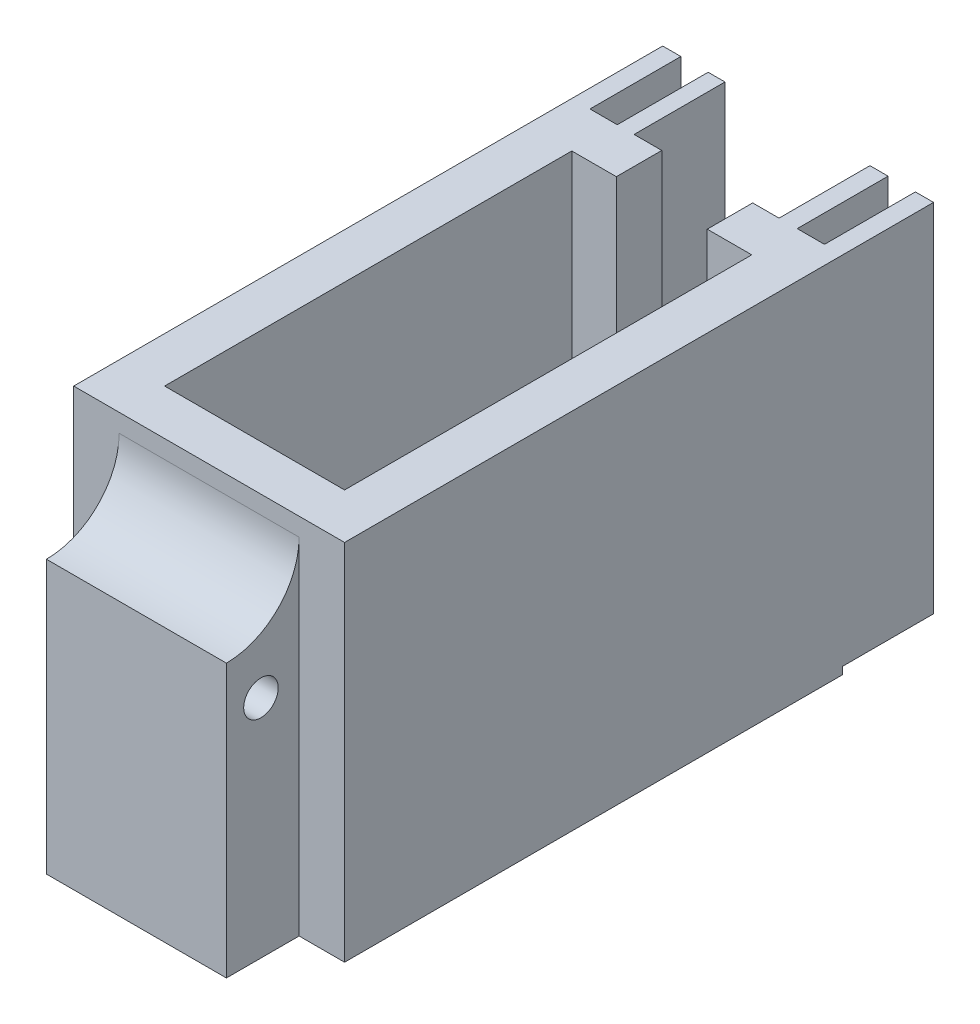
ISO-10303-21;
HEADER;
FILE_DESCRIPTION(('STEP AP214'),'2;1');
FILE_NAME('part.step','',(''),(''),'','','');
FILE_SCHEMA(('AUTOMOTIVE_DESIGN { 1 0 10303 214 1 1 1 1 }'));
ENDSEC;
DATA;
#1=APPLICATION_CONTEXT('core data for automotive mechanical design processes');
#2=APPLICATION_PROTOCOL_DEFINITION('international standard','automotive_design',2000,#1);
#3=PRODUCT_CONTEXT('',#1,'mechanical');
#4=PRODUCT('Part','Part','',(#3));
#5=PRODUCT_RELATED_PRODUCT_CATEGORY('part','',(#4));
#6=PRODUCT_DEFINITION_FORMATION('','',#4);
#7=PRODUCT_DEFINITION_CONTEXT('part definition',#1,'design');
#8=PRODUCT_DEFINITION('design','',#6,#7);
#9=PRODUCT_DEFINITION_SHAPE('','',#8);
#10=(LENGTH_UNIT() NAMED_UNIT(*) SI_UNIT(.MILLI.,.METRE.));
#11=(NAMED_UNIT(*) PLANE_ANGLE_UNIT() SI_UNIT($,.RADIAN.));
#12=(NAMED_UNIT(*) SI_UNIT($,.STERADIAN.) SOLID_ANGLE_UNIT());
#13=UNCERTAINTY_MEASURE_WITH_UNIT(LENGTH_MEASURE(1.E-05),#10,'distance_accuracy_value','');
#14=(GEOMETRIC_REPRESENTATION_CONTEXT(3) GLOBAL_UNCERTAINTY_ASSIGNED_CONTEXT((#13)) GLOBAL_UNIT_ASSIGNED_CONTEXT((#10,
#11,#12)) REPRESENTATION_CONTEXT('',''));
#15=CARTESIAN_POINT('',(0.,0.,0.));
#16=DIRECTION('',(0.,0.,1.));
#17=DIRECTION('',(1.,0.,0.));
#18=AXIS2_PLACEMENT_3D('',#15,#16,#17);
#19=CARTESIAN_POINT('',(0.,50.8,-7.19349999999999));
#20=DIRECTION('',(0.,0.,-1.));
#21=DIRECTION('',(-1.,0.,0.));
#22=AXIS2_PLACEMENT_3D('',#19,#20,#21);
#23=PLANE('',#22);
#24=DIRECTION('',(1.,0.,0.));
#25=VECTOR('',#24,1.);
#26=CARTESIAN_POINT('',(0.,50.8,-7.19349999999999));
#27=LINE('',#26,#25);
#28=CARTESIAN_POINT('',(0.839999999999997,50.8,-7.19349999999999));
#29=VERTEX_POINT('',#28);
#30=CARTESIAN_POINT('',(4.65,50.8,-7.19349999999999));
#31=VERTEX_POINT('',#30);
#32=EDGE_CURVE('E473',#29,#31,#27,.T.);
#33=ORIENTED_EDGE('',*,*,#32,.T.);
#34=DIRECTION('',(0.,-1.,0.));
#35=VECTOR('',#34,1.);
#36=CARTESIAN_POINT('',(4.65,63.7515095645257,-7.19349999999999));
#37=LINE('',#36,#35);
#38=CARTESIAN_POINT('',(4.65,5.588,-7.19349999999999));
#39=VERTEX_POINT('',#38);
#40=EDGE_CURVE('E304',#31,#39,#37,.T.);
#41=ORIENTED_EDGE('',*,*,#40,.T.);
#42=DIRECTION('',(1.,0.,0.));
#43=VECTOR('',#42,1.);
#44=CARTESIAN_POINT('',(0.,5.588,-7.19349999999999));
#45=LINE('',#44,#43);
#46=CARTESIAN_POINT('',(0.839999999999997,5.588,-7.19349999999999));
#47=VERTEX_POINT('',#46);
#48=EDGE_CURVE('E409',#47,#39,#45,.T.);
#49=ORIENTED_EDGE('',*,*,#48,.F.);
#50=DIRECTION('',(0.,-1.,0.));
#51=VECTOR('',#50,1.);
#52=CARTESIAN_POINT('',(0.839999999999997,63.7515095645257,-7.19349999999999));
#53=LINE('',#52,#51);
#54=EDGE_CURVE('E326',#29,#47,#53,.T.);
#55=ORIENTED_EDGE('',*,*,#54,.F.);
#56=EDGE_LOOP('',(#33,#41,#49,#55));
#57=FACE_BOUND('',#56,.T.);
#58=ADVANCED_FACE('F45',(#57),#23,.T.);
#59=CARTESIAN_POINT('',(-5.383,50.8,-7.19349999999999));
#60=VERTEX_POINT('',#59);
#61=CARTESIAN_POINT('',(-1.7,50.8,-7.19349999999999));
#62=VERTEX_POINT('',#61);
#63=EDGE_CURVE('E477',#60,#62,#27,.T.);
#64=ORIENTED_EDGE('',*,*,#63,.T.);
#65=DIRECTION('',(0.,-1.,0.));
#66=VECTOR('',#65,1.);
#67=CARTESIAN_POINT('',(-1.7,63.7515095645257,-7.19349999999999));
#68=LINE('',#67,#66);
#69=CARTESIAN_POINT('',(-1.7,5.588,-7.19349999999999));
#70=VERTEX_POINT('',#69);
#71=EDGE_CURVE('E330',#62,#70,#68,.T.);
#72=ORIENTED_EDGE('',*,*,#71,.T.);
#73=CARTESIAN_POINT('',(-21.9525084883911,5.588,-7.19349999999999));
#74=VERTEX_POINT('',#73);
#75=EDGE_CURVE('E413',#74,#70,#45,.T.);
#76=ORIENTED_EDGE('',*,*,#75,.F.);
#77=DIRECTION('',(0.,-1.,0.));
#78=VECTOR('',#77,1.);
#79=CARTESIAN_POINT('',(-21.9525084883911,63.7515095645257,-7.19349999999999));
#80=LINE('',#79,#78);
#81=CARTESIAN_POINT('',(-21.9525084883911,50.8,-7.19349999999999));
#82=VERTEX_POINT('',#81);
#83=EDGE_CURVE('E68',#82,#74,#80,.T.);
#84=ORIENTED_EDGE('',*,*,#83,.F.);
#85=CARTESIAN_POINT('',(-18.083,50.8,-7.19349999999999));
#86=VERTEX_POINT('',#85);
#87=EDGE_CURVE('E479',#82,#86,#27,.T.);
#88=ORIENTED_EDGE('',*,*,#87,.T.);
#89=DIRECTION('',(0.,1.,0.));
#90=VECTOR('',#89,1.);
#91=CARTESIAN_POINT('',(-18.083,50.8,-7.19349999999999));
#92=LINE('',#91,#90);
#93=CARTESIAN_POINT('',(-18.083,29.21,-7.19349999999999));
#94=VERTEX_POINT('',#93);
#95=EDGE_CURVE('E462',#94,#86,#92,.T.);
#96=ORIENTED_EDGE('',*,*,#95,.F.);
#97=DIRECTION('',(-1.,0.,0.));
#98=VECTOR('',#97,1.);
#99=CARTESIAN_POINT('',(0.,29.21,-7.19349999999999));
#100=LINE('',#99,#98);
#101=CARTESIAN_POINT('',(-5.383,29.21,-7.19349999999999));
#102=VERTEX_POINT('',#101);
#103=EDGE_CURVE('E563',#102,#94,#100,.T.);
#104=ORIENTED_EDGE('',*,*,#103,.F.);
#105=DIRECTION('',(0.,-1.,0.));
#106=VECTOR('',#105,1.);
#107=CARTESIAN_POINT('',(-5.383,50.8,-7.19349999999999));
#108=LINE('',#107,#106);
#109=EDGE_CURVE('E456',#60,#102,#108,.T.);
#110=ORIENTED_EDGE('',*,*,#109,.F.);
#111=EDGE_LOOP('',(#64,#72,#76,#84,#88,#96,#104,#110));
#112=FACE_BOUND('',#111,.T.);
#113=ADVANCED_FACE('F624',(#112),#23,.T.);
#114=DIRECTION('',(0.,-1.,0.));
#115=VECTOR('',#114,1.);
#116=CARTESIAN_POINT('',(-24.306,63.7515095645257,-7.19349999999999));
#117=LINE('',#116,#115);
#118=CARTESIAN_POINT('',(-24.306,50.8,-7.19349999999999));
#119=VERTEX_POINT('',#118);
#120=CARTESIAN_POINT('',(-24.306,5.588,-7.19349999999999));
#121=VERTEX_POINT('',#120);
#122=EDGE_CURVE('E359',#119,#121,#117,.T.);
#123=ORIENTED_EDGE('',*,*,#122,.T.);
#124=CARTESIAN_POINT('',(-28.116,5.588,-7.19349999999999));
#125=VERTEX_POINT('',#124);
#126=EDGE_CURVE('E414',#125,#121,#45,.T.);
#127=ORIENTED_EDGE('',*,*,#126,.F.);
#128=DIRECTION('',(0.,-1.,0.));
#129=VECTOR('',#128,1.);
#130=CARTESIAN_POINT('',(-28.116,63.7515095645257,-7.19349999999999));
#131=LINE('',#130,#129);
#132=CARTESIAN_POINT('',(-28.116,50.8,-7.19349999999999));
#133=VERTEX_POINT('',#132);
#134=EDGE_CURVE('E298',#133,#125,#131,.T.);
#135=ORIENTED_EDGE('',*,*,#134,.F.);
#136=EDGE_CURVE('E485',#133,#119,#27,.T.);
#137=ORIENTED_EDGE('',*,*,#136,.T.);
#138=EDGE_LOOP('',(#123,#127,#135,#137));
#139=FACE_BOUND('',#138,.T.);
#140=ADVANCED_FACE('F634',(#139),#23,.T.);
#141=CARTESIAN_POINT('',(0.,5.588,0.));
#142=DIRECTION('',(0.,1.,0.));
#143=DIRECTION('',(0.,0.,1.));
#144=AXIS2_PLACEMENT_3D('',#141,#142,#143);
#145=PLANE('',#144);
#146=ORIENTED_EDGE('',*,*,#48,.T.);
#147=DIRECTION('',(0.,0.,1.));
#148=VECTOR('',#147,1.);
#149=CARTESIAN_POINT('',(4.65,5.588,0.));
#150=LINE('',#149,#148);
#151=CARTESIAN_POINT('',(4.64999999999999,5.588,-19.8935));
#152=VERTEX_POINT('',#151);
#153=EDGE_CURVE('E301',#152,#39,#150,.T.);
#154=ORIENTED_EDGE('',*,*,#153,.F.);
#155=DIRECTION('',(1.,0.,0.));
#156=VECTOR('',#155,1.);
#157=CARTESIAN_POINT('',(0.,5.588,-19.8935));
#158=LINE('',#157,#156);
#159=CARTESIAN_POINT('',(0.839999999999997,5.588,-19.8935));
#160=VERTEX_POINT('',#159);
#161=EDGE_CURVE('E415',#160,#152,#158,.T.);
#162=ORIENTED_EDGE('',*,*,#161,.F.);
#163=DIRECTION('',(0.,0.,-1.));
#164=VECTOR('',#163,1.);
#165=CARTESIAN_POINT('',(0.839999999999996,5.588,0.));
#166=LINE('',#165,#164);
#167=EDGE_CURVE('E321',#47,#160,#166,.T.);
#168=ORIENTED_EDGE('',*,*,#167,.F.);
#169=EDGE_LOOP('',(#146,#154,#162,#168));
#170=FACE_BOUND('',#169,.T.);
#171=ADVANCED_FACE('F614',(#170),#145,.T.);
#172=CARTESIAN_POINT('',(-5.383,5.588,-13.7975));
#173=DIRECTION('',(0.,1.,0.));
#174=DIRECTION('',(0.,0.,1.));
#175=AXIS2_PLACEMENT_3D('',#172,#173,#174);
#176=CIRCLE('',#175,2.032);
#177=CARTESIAN_POINT('',(-5.383,5.588,-11.7655));
#178=VERTEX_POINT('',#177);
#179=EDGE_CURVE('E400',#178,#178,#176,.T.);
#180=ORIENTED_EDGE('',*,*,#179,.F.);
#181=EDGE_LOOP('',(#180));
#182=FACE_BOUND('',#181,.T.);
#183=CARTESIAN_POINT('',(-18.083,5.588,-13.7975));
#184=DIRECTION('',(0.,1.,0.));
#185=DIRECTION('',(0.,0.,1.));
#186=AXIS2_PLACEMENT_3D('',#183,#184,#185);
#187=CIRCLE('',#186,2.032);
#188=CARTESIAN_POINT('',(-18.083,5.588,-11.7655));
#189=VERTEX_POINT('',#188);
#190=EDGE_CURVE('E404',#189,#189,#187,.T.);
#191=ORIENTED_EDGE('',*,*,#190,.F.);
#192=EDGE_LOOP('',(#191));
#193=FACE_BOUND('',#192,.T.);
#194=ORIENTED_EDGE('',*,*,#75,.T.);
#195=DIRECTION('',(0.,0.,1.));
#196=VECTOR('',#195,1.);
#197=CARTESIAN_POINT('',(-1.7,5.588,0.));
#198=LINE('',#197,#196);
#199=CARTESIAN_POINT('',(-1.70000000000001,5.588,-19.8935));
#200=VERTEX_POINT('',#199);
#201=EDGE_CURVE('E327',#200,#70,#198,.T.);
#202=ORIENTED_EDGE('',*,*,#201,.F.);
#203=CARTESIAN_POINT('',(-21.9525084883911,5.588,-19.8935));
#204=VERTEX_POINT('',#203);
#205=EDGE_CURVE('E419',#204,#200,#158,.T.);
#206=ORIENTED_EDGE('',*,*,#205,.F.);
#207=DIRECTION('',(0.,0.,1.));
#208=VECTOR('',#207,1.);
#209=CARTESIAN_POINT('',(-21.9525084883911,5.588,0.));
#210=LINE('',#209,#208);
#211=EDGE_CURVE('E356',#204,#74,#210,.T.);
#212=ORIENTED_EDGE('',*,*,#211,.T.);
#213=EDGE_LOOP('',(#194,#202,#206,#212));
#214=FACE_BOUND('',#213,.T.);
#215=ADVANCED_FACE('F648',(#182,#193,#214),#145,.T.);
#216=DIRECTION('',(0.,0.,-1.));
#217=VECTOR('',#216,1.);
#218=CARTESIAN_POINT('',(-24.306,5.588,0.));
#219=LINE('',#218,#217);
#220=CARTESIAN_POINT('',(-24.306,5.588,-19.8935));
#221=VERTEX_POINT('',#220);
#222=EDGE_CURVE('E353',#121,#221,#219,.T.);
#223=ORIENTED_EDGE('',*,*,#222,.T.);
#224=CARTESIAN_POINT('',(-28.116,5.588,-19.8935));
#225=VERTEX_POINT('',#224);
#226=EDGE_CURVE('E420',#225,#221,#158,.T.);
#227=ORIENTED_EDGE('',*,*,#226,.F.);
#228=DIRECTION('',(0.,0.,-1.));
#229=VECTOR('',#228,1.);
#230=CARTESIAN_POINT('',(-28.116,5.588,0.));
#231=LINE('',#230,#229);
#232=EDGE_CURVE('E384',#125,#225,#231,.T.);
#233=ORIENTED_EDGE('',*,*,#232,.F.);
#234=ORIENTED_EDGE('',*,*,#126,.T.);
#235=EDGE_LOOP('',(#223,#227,#233,#234));
#236=FACE_BOUND('',#235,.T.);
#237=ADVANCED_FACE('F654',(#236),#145,.T.);
#238=DIRECTION('',(0.,-1.,0.));
#239=VECTOR('',#238,1.);
#240=CARTESIAN_POINT('',(-30.656,50.8,-7.19349999999999));
#241=LINE('',#240,#239);
#242=CARTESIAN_POINT('',(-30.656,1.016,-7.19349999999999));
#243=VERTEX_POINT('',#242);
#244=CARTESIAN_POINT('',(-30.656,0.,-7.19349999999999));
#245=VERTEX_POINT('',#244);
#246=EDGE_CURVE('E539',#243,#245,#241,.T.);
#247=ORIENTED_EDGE('',*,*,#246,.F.);
#248=DIRECTION('',(1.,0.,0.));
#249=VECTOR('',#248,1.);
#250=CARTESIAN_POINT('',(0.,1.016,-7.19349999999999));
#251=LINE('',#250,#249);
#252=CARTESIAN_POINT('',(7.19,1.016,-7.19349999999999));
#253=VERTEX_POINT('',#252);
#254=EDGE_CURVE('E432',#243,#253,#251,.T.);
#255=ORIENTED_EDGE('',*,*,#254,.T.);
#256=DIRECTION('',(0.,-1.,0.));
#257=VECTOR('',#256,1.);
#258=CARTESIAN_POINT('',(7.19,50.8,-7.19349999999999));
#259=LINE('',#258,#257);
#260=CARTESIAN_POINT('',(7.19,0.,-7.19349999999999));
#261=VERTEX_POINT('',#260);
#262=EDGE_CURVE('E509',#253,#261,#259,.T.);
#263=ORIENTED_EDGE('',*,*,#262,.T.);
#264=DIRECTION('',(1.,0.,0.));
#265=VECTOR('',#264,1.);
#266=CARTESIAN_POINT('',(0.,0.,-7.19349999999999));
#267=LINE('',#266,#265);
#268=EDGE_CURVE('E472',#245,#261,#267,.T.);
#269=ORIENTED_EDGE('',*,*,#268,.F.);
#270=EDGE_LOOP('',(#247,#255,#263,#269));
#271=FACE_BOUND('',#270,.T.);
#272=ADVANCED_FACE('F594',(#271),#23,.T.);
#273=CARTESIAN_POINT('',(-24.306,50.8,0.));
#274=DIRECTION('',(1.,0.,0.));
#275=DIRECTION('',(0.,0.,-1.));
#276=AXIS2_PLACEMENT_3D('',#273,#274,#275);
#277=PLANE('',#276);
#278=DIRECTION('',(0.,0.,1.));
#279=VECTOR('',#278,1.);
#280=CARTESIAN_POINT('',(-24.306,0.,0.));
#281=LINE('',#280,#279);
#282=CARTESIAN_POINT('',(-24.306,0.,-0.843499999999997));
#283=VERTEX_POINT('',#282);
#284=CARTESIAN_POINT('',(-24.306,0.,56.0525));
#285=VERTEX_POINT('',#284);
#286=EDGE_CURVE('E520',#283,#285,#281,.T.);
#287=ORIENTED_EDGE('',*,*,#286,.F.);
#288=DIRECTION('',(0.,-1.,0.));
#289=VECTOR('',#288,1.);
#290=CARTESIAN_POINT('',(-24.306,50.8,-0.843499999999997));
#291=LINE('',#290,#289);
#292=CARTESIAN_POINT('',(-24.306,50.8,-0.843499999999997));
#293=VERTEX_POINT('',#292);
#294=EDGE_CURVE('E545',#293,#283,#291,.T.);
#295=ORIENTED_EDGE('',*,*,#294,.F.);
#296=DIRECTION('',(0.,0.,1.));
#297=VECTOR('',#296,1.);
#298=CARTESIAN_POINT('',(-24.306,50.8,0.));
#299=LINE('',#298,#297);
#300=CARTESIAN_POINT('',(-24.306,50.8,56.0525));
#301=VERTEX_POINT('',#300);
#302=EDGE_CURVE('E492',#293,#301,#299,.T.);
#303=ORIENTED_EDGE('',*,*,#302,.T.);
#304=DIRECTION('',(0.,-1.,0.));
#305=VECTOR('',#304,1.);
#306=CARTESIAN_POINT('',(-24.306,50.8,56.0525));
#307=LINE('',#306,#305);
#308=EDGE_CURVE('E535',#301,#285,#307,.T.);
#309=ORIENTED_EDGE('',*,*,#308,.T.);
#310=EDGE_LOOP('',(#287,#295,#303,#309));
#311=FACE_BOUND('',#310,.T.);
#312=ADVANCED_FACE('F677',(#311),#277,.T.);
#313=CARTESIAN_POINT('',(0.,50.8,-0.8435));
#314=DIRECTION('',(0.,0.,1.));
#315=DIRECTION('',(1.,0.,0.));
#316=AXIS2_PLACEMENT_3D('',#313,#314,#315);
#317=PLANE('',#316);
#318=DIRECTION('',(0.,-1.,0.));
#319=VECTOR('',#318,1.);
#320=CARTESIAN_POINT('',(-18.083,50.8,-0.843499999999998));
#321=LINE('',#320,#319);
#322=CARTESIAN_POINT('',(-18.083,50.8,-0.8435));
#323=VERTEX_POINT('',#322);
#324=CARTESIAN_POINT('',(-18.083,29.21,-0.8435));
#325=VERTEX_POINT('',#324);
#326=EDGE_CURVE('E466',#323,#325,#321,.T.);
#327=ORIENTED_EDGE('',*,*,#326,.F.);
#328=DIRECTION('',(-1.,0.,0.));
#329=VECTOR('',#328,1.);
#330=CARTESIAN_POINT('',(0.,50.8,-0.8435));
#331=LINE('',#330,#329);
#332=EDGE_CURVE('E496',#323,#293,#331,.T.);
#333=ORIENTED_EDGE('',*,*,#332,.T.);
#334=ORIENTED_EDGE('',*,*,#294,.T.);
#335=DIRECTION('',(-1.,0.,0.));
#336=VECTOR('',#335,1.);
#337=CARTESIAN_POINT('',(0.,0.,-0.8435));
#338=LINE('',#337,#336);
#339=CARTESIAN_POINT('',(0.84,0.,-0.8435));
#340=VERTEX_POINT('',#339);
#341=EDGE_CURVE('E524',#340,#283,#338,.T.);
#342=ORIENTED_EDGE('',*,*,#341,.F.);
#343=DIRECTION('',(0.,-1.,0.));
#344=VECTOR('',#343,1.);
#345=CARTESIAN_POINT('',(0.84,50.8,-0.8435));
#346=LINE('',#345,#344);
#347=CARTESIAN_POINT('',(0.84,50.8,-0.8435));
#348=VERTEX_POINT('',#347);
#349=EDGE_CURVE('E542',#348,#340,#346,.T.);
#350=ORIENTED_EDGE('',*,*,#349,.F.);
#351=CARTESIAN_POINT('',(-5.383,50.8,-0.843499999999999));
#352=VERTEX_POINT('',#351);
#353=EDGE_CURVE('E497',#348,#352,#331,.T.);
#354=ORIENTED_EDGE('',*,*,#353,.T.);
#355=DIRECTION('',(0.,1.,0.));
#356=VECTOR('',#355,1.);
#357=CARTESIAN_POINT('',(-5.383,50.8,-0.843499999999999));
#358=LINE('',#357,#356);
#359=CARTESIAN_POINT('',(-5.383,29.21,-0.843500000000001));
#360=VERTEX_POINT('',#359);
#361=EDGE_CURVE('E459',#360,#352,#358,.T.);
#362=ORIENTED_EDGE('',*,*,#361,.F.);
#363=DIRECTION('',(1.,0.,0.));
#364=VECTOR('',#363,1.);
#365=CARTESIAN_POINT('',(0.,29.21,-0.8435));
#366=LINE('',#365,#364);
#367=EDGE_CURVE('E469',#325,#360,#366,.T.);
#368=ORIENTED_EDGE('',*,*,#367,.F.);
#369=EDGE_LOOP('',(#327,#333,#334,#342,#350,#354,#362,#368));
#370=FACE_BOUND('',#369,.T.);
#371=ADVANCED_FACE('F683',(#370),#317,.T.);
#372=CARTESIAN_POINT('',(0.84,50.8,0.));
#373=DIRECTION('',(-1.,0.,0.));
#374=DIRECTION('',(0.,0.,1.));
#375=AXIS2_PLACEMENT_3D('',#372,#373,#374);
#376=PLANE('',#375);
#377=DIRECTION('',(0.,0.,-1.));
#378=VECTOR('',#377,1.);
#379=CARTESIAN_POINT('',(0.84,0.,0.));
#380=LINE('',#379,#378);
#381=CARTESIAN_POINT('',(0.84,0.,56.0525));
#382=VERTEX_POINT('',#381);
#383=EDGE_CURVE('E528',#382,#340,#380,.T.);
#384=ORIENTED_EDGE('',*,*,#383,.F.);
#385=DIRECTION('',(0.,-1.,0.));
#386=VECTOR('',#385,1.);
#387=CARTESIAN_POINT('',(0.84,50.8,56.0525));
#388=LINE('',#387,#386);
#389=CARTESIAN_POINT('',(0.84,50.8,56.0525));
#390=VERTEX_POINT('',#389);
#391=EDGE_CURVE('E538',#390,#382,#388,.T.);
#392=ORIENTED_EDGE('',*,*,#391,.F.);
#393=DIRECTION('',(0.,0.,-1.));
#394=VECTOR('',#393,1.);
#395=CARTESIAN_POINT('',(0.84,50.8,0.));
#396=LINE('',#395,#394);
#397=EDGE_CURVE('E501',#390,#348,#396,.T.);
#398=ORIENTED_EDGE('',*,*,#397,.T.);
#399=ORIENTED_EDGE('',*,*,#349,.T.);
#400=EDGE_LOOP('',(#384,#392,#398,#399));
#401=FACE_BOUND('',#400,.T.);
#402=ADVANCED_FACE('F723',(#401),#376,.T.);
#403=CARTESIAN_POINT('',(-30.656,50.8,0.));
#404=DIRECTION('',(1.,0.,0.));
#405=DIRECTION('',(0.,0.,-1.));
#406=AXIS2_PLACEMENT_3D('',#403,#404,#405);
#407=PLANE('',#406);
#408=DIRECTION('',(0.,0.,1.));
#409=VECTOR('',#408,1.);
#410=CARTESIAN_POINT('',(-30.656,0.,0.));
#411=LINE('',#410,#409);
#412=CARTESIAN_POINT('',(-30.656,0.,62.4025));
#413=VERTEX_POINT('',#412);
#414=EDGE_CURVE('E513',#245,#413,#411,.T.);
#415=ORIENTED_EDGE('',*,*,#414,.T.);
#416=DIRECTION('',(0.,-1.,0.));
#417=VECTOR('',#416,1.);
#418=CARTESIAN_POINT('',(-30.656,50.8,62.4025));
#419=LINE('',#418,#417);
#420=CARTESIAN_POINT('',(-30.656,50.8,62.4025));
#421=VERTEX_POINT('',#420);
#422=EDGE_CURVE('E257',#421,#413,#419,.T.);
#423=ORIENTED_EDGE('',*,*,#422,.F.);
#424=DIRECTION('',(0.,0.,1.));
#425=VECTOR('',#424,1.);
#426=CARTESIAN_POINT('',(-30.656,50.8,0.));
#427=LINE('',#426,#425);
#428=CARTESIAN_POINT('',(-30.656,50.8,-19.8935));
#429=VERTEX_POINT('',#428);
#430=EDGE_CURVE('E480',#429,#421,#427,.T.);
#431=ORIENTED_EDGE('',*,*,#430,.F.);
#432=DIRECTION('',(0.,-1.,0.));
#433=VECTOR('',#432,1.);
#434=CARTESIAN_POINT('',(-30.656,5.588,-19.8935));
#435=LINE('',#434,#433);
#436=CARTESIAN_POINT('',(-30.656,1.016,-19.8935));
#437=VERTEX_POINT('',#436);
#438=EDGE_CURVE('E442',#429,#437,#435,.T.);
#439=ORIENTED_EDGE('',*,*,#438,.T.);
#440=DIRECTION('',(0.,0.,-1.));
#441=VECTOR('',#440,1.);
#442=CARTESIAN_POINT('',(-30.656,1.016,0.));
#443=LINE('',#442,#441);
#444=EDGE_CURVE('E428',#243,#437,#443,.T.);
#445=ORIENTED_EDGE('',*,*,#444,.F.);
#446=ORIENTED_EDGE('',*,*,#246,.T.);
#447=EDGE_LOOP('',(#415,#423,#431,#439,#445,#446));
#448=FACE_BOUND('',#447,.T.);
#449=ADVANCED_FACE('F591',(#448),#407,.F.);
#450=CARTESIAN_POINT('',(0.,50.8,62.4025));
#451=DIRECTION('',(0.,0.,1.));
#452=DIRECTION('',(1.,0.,0.));
#453=AXIS2_PLACEMENT_3D('',#450,#451,#452);
#454=PLANE('',#453);
#455=DIRECTION('',(-1.,0.,0.));
#456=VECTOR('',#455,1.);
#457=CARTESIAN_POINT('',(0.,50.8,62.4025));
#458=LINE('',#457,#456);
#459=CARTESIAN_POINT('',(7.19000000000001,50.8,62.4025));
#460=VERTEX_POINT('',#459);
#461=EDGE_CURVE('E484',#460,#421,#458,.T.);
#462=ORIENTED_EDGE('',*,*,#461,.T.);
#463=ORIENTED_EDGE('',*,*,#422,.T.);
#464=DIRECTION('',(-1.,0.,0.));
#465=VECTOR('',#464,1.);
#466=CARTESIAN_POINT('',(-30.656,0.,62.4025));
#467=LINE('',#466,#465);
#468=CARTESIAN_POINT('',(-24.306,0.,62.4025));
#469=VERTEX_POINT('',#468);
#470=EDGE_CURVE('E252',#469,#413,#467,.T.);
#471=ORIENTED_EDGE('',*,*,#470,.F.);
#472=DIRECTION('',(0.,1.,0.));
#473=VECTOR('',#472,1.);
#474=CARTESIAN_POINT('',(-24.306,0.,62.4025));
#475=LINE('',#474,#473);
#476=CARTESIAN_POINT('',(-24.306,48.26,62.4025));
#477=VERTEX_POINT('',#476);
#478=EDGE_CURVE('E241',#469,#477,#475,.T.);
#479=ORIENTED_EDGE('',*,*,#478,.T.);
#480=DIRECTION('',(-1.,0.,0.));
#481=VECTOR('',#480,1.);
#482=CARTESIAN_POINT('',(7.19,48.26,62.4025));
#483=LINE('',#482,#481);
#484=CARTESIAN_POINT('',(0.84,48.26,62.4025));
#485=VERTEX_POINT('',#484);
#486=EDGE_CURVE('E566',#477,#485,#483,.F.);
#487=ORIENTED_EDGE('',*,*,#486,.T.);
#488=DIRECTION('',(0.,1.,0.));
#489=VECTOR('',#488,1.);
#490=CARTESIAN_POINT('',(0.84,0.,62.4025));
#491=LINE('',#490,#489);
#492=CARTESIAN_POINT('',(0.84,0.,62.4025));
#493=VERTEX_POINT('',#492);
#494=EDGE_CURVE('E277',#493,#485,#491,.T.);
#495=ORIENTED_EDGE('',*,*,#494,.F.);
#496=DIRECTION('',(-1.,0.,0.));
#497=VECTOR('',#496,1.);
#498=CARTESIAN_POINT('',(7.19000000000001,0.,62.4025));
#499=LINE('',#498,#497);
#500=CARTESIAN_POINT('',(7.19000000000001,0.,62.4025));
#501=VERTEX_POINT('',#500);
#502=EDGE_CURVE('E270',#501,#493,#499,.T.);
#503=ORIENTED_EDGE('',*,*,#502,.F.);
#504=DIRECTION('',(0.,-1.,0.));
#505=VECTOR('',#504,1.);
#506=CARTESIAN_POINT('',(7.19000000000001,50.8,62.4025));
#507=LINE('',#506,#505);
#508=EDGE_CURVE('E551',#460,#501,#507,.T.);
#509=ORIENTED_EDGE('',*,*,#508,.F.);
#510=EDGE_LOOP('',(#462,#463,#471,#479,#487,#495,#503,#509));
#511=FACE_BOUND('',#510,.T.);
#512=ADVANCED_FACE('F255',(#511),#454,.T.);
#513=CARTESIAN_POINT('',(7.19,50.8,0.));
#514=DIRECTION('',(1.,0.,0.));
#515=DIRECTION('',(0.,0.,-1.));
#516=AXIS2_PLACEMENT_3D('',#513,#514,#515);
#517=PLANE('',#516);
#518=ORIENTED_EDGE('',*,*,#508,.T.);
#519=DIRECTION('',(0.,0.,1.));
#520=VECTOR('',#519,1.);
#521=CARTESIAN_POINT('',(7.19,0.,0.));
#522=LINE('',#521,#520);
#523=EDGE_CURVE('E516',#261,#501,#522,.T.);
#524=ORIENTED_EDGE('',*,*,#523,.F.);
#525=ORIENTED_EDGE('',*,*,#262,.F.);
#526=DIRECTION('',(0.,0.,1.));
#527=VECTOR('',#526,1.);
#528=CARTESIAN_POINT('',(7.19,1.016,0.));
#529=LINE('',#528,#527);
#530=CARTESIAN_POINT('',(7.19,1.016,-19.8935));
#531=VERTEX_POINT('',#530);
#532=EDGE_CURVE('E435',#531,#253,#529,.T.);
#533=ORIENTED_EDGE('',*,*,#532,.F.);
#534=DIRECTION('',(0.,-1.,0.));
#535=VECTOR('',#534,1.);
#536=CARTESIAN_POINT('',(7.19,5.588,-19.8935));
#537=LINE('',#536,#535);
#538=CARTESIAN_POINT('',(7.19,50.8,-19.8935));
#539=VERTEX_POINT('',#538);
#540=EDGE_CURVE('E445',#539,#531,#537,.T.);
#541=ORIENTED_EDGE('',*,*,#540,.F.);
#542=DIRECTION('',(0.,0.,1.));
#543=VECTOR('',#542,1.);
#544=CARTESIAN_POINT('',(7.19,50.8,0.));
#545=LINE('',#544,#543);
#546=EDGE_CURVE('E488',#539,#460,#545,.T.);
#547=ORIENTED_EDGE('',*,*,#546,.T.);
#548=EDGE_LOOP('',(#518,#524,#525,#533,#541,#547));
#549=FACE_BOUND('',#548,.T.);
#550=ADVANCED_FACE('F582',(#549),#517,.T.);
#551=CARTESIAN_POINT('',(0.,50.8,56.0525));
#552=DIRECTION('',(0.,0.,-1.));
#553=DIRECTION('',(-1.,0.,0.));
#554=AXIS2_PLACEMENT_3D('',#551,#552,#553);
#555=PLANE('',#554);
#556=DIRECTION('',(1.,0.,0.));
#557=VECTOR('',#556,1.);
#558=CARTESIAN_POINT('',(0.,0.,56.0525));
#559=LINE('',#558,#557);
#560=EDGE_CURVE('E478',#285,#382,#559,.T.);
#561=ORIENTED_EDGE('',*,*,#560,.F.);
#562=ORIENTED_EDGE('',*,*,#308,.F.);
#563=DIRECTION('',(1.,0.,0.));
#564=VECTOR('',#563,1.);
#565=CARTESIAN_POINT('',(0.,50.8,56.0525));
#566=LINE('',#565,#564);
#567=EDGE_CURVE('E505',#301,#390,#566,.T.);
#568=ORIENTED_EDGE('',*,*,#567,.T.);
#569=ORIENTED_EDGE('',*,*,#391,.T.);
#570=EDGE_LOOP('',(#561,#562,#568,#569));
#571=FACE_BOUND('',#570,.T.);
#572=ADVANCED_FACE('F717',(#571),#555,.T.);
#573=CARTESIAN_POINT('',(0.,50.8,0.));
#574=DIRECTION('',(0.,1.,0.));
#575=DIRECTION('',(0.,0.,1.));
#576=AXIS2_PLACEMENT_3D('',#573,#574,#575);
#577=PLANE('',#576);
#578=DIRECTION('',(0.,0.,1.));
#579=VECTOR('',#578,1.);
#580=CARTESIAN_POINT('',(-18.083,50.8,0.));
#581=LINE('',#580,#579);
#582=EDGE_CURVE('E560',#86,#323,#581,.T.);
#583=ORIENTED_EDGE('',*,*,#582,.F.);
#584=ORIENTED_EDGE('',*,*,#87,.F.);
#585=DIRECTION('',(0.,0.,1.));
#586=VECTOR('',#585,1.);
#587=CARTESIAN_POINT('',(-21.9525084883911,50.8,0.));
#588=LINE('',#587,#586);
#589=CARTESIAN_POINT('',(-21.9525084883911,50.8,-19.8935));
#590=VERTEX_POINT('',#589);
#591=EDGE_CURVE('E368',#590,#82,#588,.T.);
#592=ORIENTED_EDGE('',*,*,#591,.F.);
#593=DIRECTION('',(-1.,0.,0.));
#594=VECTOR('',#593,1.);
#595=CARTESIAN_POINT('',(0.,50.8,-19.8935));
#596=LINE('',#595,#594);
#597=CARTESIAN_POINT('',(-24.306,50.8,-19.8935));
#598=VERTEX_POINT('',#597);
#599=EDGE_CURVE('E352',#590,#598,#596,.T.);
#600=ORIENTED_EDGE('',*,*,#599,.T.);
#601=DIRECTION('',(0.,0.,-1.));
#602=VECTOR('',#601,1.);
#603=CARTESIAN_POINT('',(-24.306,50.8,0.));
#604=LINE('',#603,#602);
#605=EDGE_CURVE('E360',#119,#598,#604,.T.);
#606=ORIENTED_EDGE('',*,*,#605,.F.);
#607=ORIENTED_EDGE('',*,*,#136,.F.);
#608=DIRECTION('',(0.,0.,-1.));
#609=VECTOR('',#608,1.);
#610=CARTESIAN_POINT('',(-28.116,50.8,0.));
#611=LINE('',#610,#609);
#612=CARTESIAN_POINT('',(-28.116,50.8,-19.8935));
#613=VERTEX_POINT('',#612);
#614=EDGE_CURVE('E392',#133,#613,#611,.T.);
#615=ORIENTED_EDGE('',*,*,#614,.T.);
#616=DIRECTION('',(-1.,0.,0.));
#617=VECTOR('',#616,1.);
#618=CARTESIAN_POINT('',(0.,50.8,-19.8935));
#619=LINE('',#618,#617);
#620=EDGE_CURVE('E372',#613,#429,#619,.T.);
#621=ORIENTED_EDGE('',*,*,#620,.T.);
#622=ORIENTED_EDGE('',*,*,#430,.T.);
#623=ORIENTED_EDGE('',*,*,#461,.F.);
#624=ORIENTED_EDGE('',*,*,#546,.F.);
#625=DIRECTION('',(-1.,0.,0.));
#626=VECTOR('',#625,1.);
#627=CARTESIAN_POINT('',(0.,50.8,-19.8935));
#628=LINE('',#627,#626);
#629=CARTESIAN_POINT('',(4.64999999999999,50.8,-19.8935));
#630=VERTEX_POINT('',#629);
#631=EDGE_CURVE('E311',#539,#630,#628,.T.);
#632=ORIENTED_EDGE('',*,*,#631,.T.);
#633=DIRECTION('',(0.,0.,1.));
#634=VECTOR('',#633,1.);
#635=CARTESIAN_POINT('',(4.65,50.8,0.));
#636=LINE('',#635,#634);
#637=EDGE_CURVE('E306',#630,#31,#636,.T.);
#638=ORIENTED_EDGE('',*,*,#637,.T.);
#639=ORIENTED_EDGE('',*,*,#32,.F.);
#640=DIRECTION('',(0.,0.,-1.));
#641=VECTOR('',#640,1.);
#642=CARTESIAN_POINT('',(0.839999999999996,50.8,0.));
#643=LINE('',#642,#641);
#644=CARTESIAN_POINT('',(0.839999999999997,50.8,-19.8935));
#645=VERTEX_POINT('',#644);
#646=EDGE_CURVE('E325',#29,#645,#643,.T.);
#647=ORIENTED_EDGE('',*,*,#646,.T.);
#648=DIRECTION('',(-1.,0.,0.));
#649=VECTOR('',#648,1.);
#650=CARTESIAN_POINT('',(0.,50.8,-19.8935));
#651=LINE('',#650,#649);
#652=CARTESIAN_POINT('',(-1.70000000000001,50.8,-19.8935));
#653=VERTEX_POINT('',#652);
#654=EDGE_CURVE('E335',#645,#653,#651,.T.);
#655=ORIENTED_EDGE('',*,*,#654,.T.);
#656=DIRECTION('',(0.,0.,1.));
#657=VECTOR('',#656,1.);
#658=CARTESIAN_POINT('',(-1.7,50.8,0.));
#659=LINE('',#658,#657);
#660=EDGE_CURVE('E317',#653,#62,#659,.T.);
#661=ORIENTED_EDGE('',*,*,#660,.T.);
#662=ORIENTED_EDGE('',*,*,#63,.F.);
#663=DIRECTION('',(0.,0.,-1.));
#664=VECTOR('',#663,1.);
#665=CARTESIAN_POINT('',(-5.383,50.8,0.));
#666=LINE('',#665,#664);
#667=EDGE_CURVE('E548',#352,#60,#666,.T.);
#668=ORIENTED_EDGE('',*,*,#667,.F.);
#669=ORIENTED_EDGE('',*,*,#353,.F.);
#670=ORIENTED_EDGE('',*,*,#397,.F.);
#671=ORIENTED_EDGE('',*,*,#567,.F.);
#672=ORIENTED_EDGE('',*,*,#302,.F.);
#673=ORIENTED_EDGE('',*,*,#332,.F.);
#674=EDGE_LOOP('',(#583,#584,#592,#600,#606,#607,#615,#621,#622,#623,#624,#632,#638,#639,#647,
#655,#661,#662,#668,#669,#670,#671,#672,#673));
#675=FACE_BOUND('',#674,.T.);
#676=ADVANCED_FACE('F588',(#675),#577,.T.);
#677=CARTESIAN_POINT('',(0.,0.,0.));
#678=DIRECTION('',(0.,1.,0.));
#679=DIRECTION('',(0.,0.,1.));
#680=AXIS2_PLACEMENT_3D('',#677,#678,#679);
#681=PLANE('',#680);
#682=DIRECTION('',(0.,0.,-1.));
#683=VECTOR('',#682,1.);
#684=CARTESIAN_POINT('',(-24.306,0.,62.4025));
#685=LINE('',#684,#683);
#686=CARTESIAN_POINT('',(-24.306,0.,72.5625));
#687=VERTEX_POINT('',#686);
#688=EDGE_CURVE('E246',#687,#469,#685,.T.);
#689=ORIENTED_EDGE('',*,*,#688,.T.);
#690=ORIENTED_EDGE('',*,*,#470,.T.);
#691=ORIENTED_EDGE('',*,*,#414,.F.);
#692=ORIENTED_EDGE('',*,*,#268,.T.);
#693=ORIENTED_EDGE('',*,*,#523,.T.);
#694=ORIENTED_EDGE('',*,*,#502,.T.);
#695=DIRECTION('',(0.,0.,1.));
#696=VECTOR('',#695,1.);
#697=CARTESIAN_POINT('',(0.84,0.,62.4025));
#698=LINE('',#697,#696);
#699=CARTESIAN_POINT('',(0.840000000000001,0.,72.5625));
#700=VERTEX_POINT('',#699);
#701=EDGE_CURVE('E274',#493,#700,#698,.T.);
#702=ORIENTED_EDGE('',*,*,#701,.T.);
#703=DIRECTION('',(-1.,0.,0.));
#704=VECTOR('',#703,1.);
#705=CARTESIAN_POINT('',(46.6214037285005,0.,72.5625));
#706=LINE('',#705,#704);
#707=EDGE_CURVE('E268',#700,#687,#706,.T.);
#708=ORIENTED_EDGE('',*,*,#707,.T.);
#709=EDGE_LOOP('',(#689,#690,#691,#692,#693,#694,#702,#708));
#710=FACE_BOUND('',#709,.T.);
#711=ORIENTED_EDGE('',*,*,#286,.T.);
#712=ORIENTED_EDGE('',*,*,#560,.T.);
#713=ORIENTED_EDGE('',*,*,#383,.T.);
#714=ORIENTED_EDGE('',*,*,#341,.T.);
#715=EDGE_LOOP('',(#711,#712,#713,#714));
#716=FACE_BOUND('',#715,.T.);
#717=ADVANCED_FACE('F264',(#710,#716),#681,.F.);
#718=CARTESIAN_POINT('',(0.,29.21,-7.19351199999999));
#719=DIRECTION('',(0.,-1.,0.));
#720=DIRECTION('',(0.,0.,-1.));
#721=AXIS2_PLACEMENT_3D('',#718,#719,#720);
#722=PLANE('',#721);
#723=ORIENTED_EDGE('',*,*,#367,.T.);
#724=DIRECTION('',(0.,0.,1.));
#725=VECTOR('',#724,1.);
#726=CARTESIAN_POINT('',(-5.383,29.21,-7.19351199999999));
#727=LINE('',#726,#725);
#728=EDGE_CURVE('E448',#102,#360,#727,.T.);
#729=ORIENTED_EDGE('',*,*,#728,.F.);
#730=ORIENTED_EDGE('',*,*,#103,.T.);
#731=DIRECTION('',(0.,0.,1.));
#732=VECTOR('',#731,1.);
#733=CARTESIAN_POINT('',(-18.083,29.21,-7.19351199999999));
#734=LINE('',#733,#732);
#735=EDGE_CURVE('E452',#94,#325,#734,.T.);
#736=ORIENTED_EDGE('',*,*,#735,.T.);
#737=EDGE_LOOP('',(#723,#729,#730,#736));
#738=FACE_BOUND('',#737,.T.);
#739=ADVANCED_FACE('F710',(#738),#722,.F.);
#740=CARTESIAN_POINT('',(-18.083,0.,-7.19351199999999));
#741=DIRECTION('',(-1.,0.,0.));
#742=DIRECTION('',(0.,-1.,0.));
#743=AXIS2_PLACEMENT_3D('',#740,#741,#742);
#744=PLANE('',#743);
#745=ORIENTED_EDGE('',*,*,#326,.T.);
#746=ORIENTED_EDGE('',*,*,#735,.F.);
#747=ORIENTED_EDGE('',*,*,#95,.T.);
#748=ORIENTED_EDGE('',*,*,#582,.T.);
#749=EDGE_LOOP('',(#745,#746,#747,#748));
#750=FACE_BOUND('',#749,.T.);
#751=ADVANCED_FACE('F706',(#750),#744,.F.);
#752=CARTESIAN_POINT('',(-5.383,0.,-7.19351199999999));
#753=DIRECTION('',(1.,0.,0.));
#754=DIRECTION('',(0.,0.,-1.));
#755=AXIS2_PLACEMENT_3D('',#752,#753,#754);
#756=PLANE('',#755);
#757=ORIENTED_EDGE('',*,*,#361,.T.);
#758=ORIENTED_EDGE('',*,*,#667,.T.);
#759=ORIENTED_EDGE('',*,*,#109,.T.);
#760=ORIENTED_EDGE('',*,*,#728,.T.);
#761=EDGE_LOOP('',(#757,#758,#759,#760));
#762=FACE_BOUND('',#761,.T.);
#763=ADVANCED_FACE('F700',(#762),#756,.F.);
#764=CARTESIAN_POINT('',(-18.083,5.588,-13.7975));
#765=DIRECTION('',(0.,-1.,0.));
#766=DIRECTION('',(0.,0.,-1.));
#767=AXIS2_PLACEMENT_3D('',#764,#765,#766);
#768=CYLINDRICAL_SURFACE('',#767,2.032);
#769=ORIENTED_EDGE('',*,*,#190,.T.);
#770=EDGE_LOOP('',(#769));
#771=FACE_BOUND('',#770,.T.);
#772=CARTESIAN_POINT('',(-18.083,1.016,-13.7975));
#773=DIRECTION('',(0.,1.,0.));
#774=DIRECTION('',(0.,0.,1.));
#775=AXIS2_PLACEMENT_3D('',#772,#773,#774);
#776=CIRCLE('',#775,2.032);
#777=CARTESIAN_POINT('',(-18.083,1.016,-11.7655));
#778=VERTEX_POINT('',#777);
#779=EDGE_CURVE('E424',#778,#778,#776,.T.);
#780=ORIENTED_EDGE('',*,*,#779,.F.);
#781=EDGE_LOOP('',(#780));
#782=FACE_BOUND('',#781,.T.);
#783=ADVANCED_FACE('F698',(#771,#782),#768,.F.);
#784=CARTESIAN_POINT('',(-5.383,5.588,-13.7975));
#785=DIRECTION('',(0.,-1.,0.));
#786=DIRECTION('',(0.,0.,-1.));
#787=AXIS2_PLACEMENT_3D('',#784,#785,#786);
#788=CYLINDRICAL_SURFACE('',#787,2.032);
#789=ORIENTED_EDGE('',*,*,#179,.T.);
#790=EDGE_LOOP('',(#789));
#791=FACE_BOUND('',#790,.T.);
#792=CARTESIAN_POINT('',(-5.383,1.016,-13.7975));
#793=DIRECTION('',(0.,1.,0.));
#794=DIRECTION('',(0.,0.,1.));
#795=AXIS2_PLACEMENT_3D('',#792,#793,#794);
#796=CIRCLE('',#795,2.032);
#797=CARTESIAN_POINT('',(-5.383,1.016,-11.7655));
#798=VERTEX_POINT('',#797);
#799=EDGE_CURVE('E310',#798,#798,#796,.T.);
#800=ORIENTED_EDGE('',*,*,#799,.F.);
#801=EDGE_LOOP('',(#800));
#802=FACE_BOUND('',#801,.T.);
#803=ADVANCED_FACE('F697',(#791,#802),#788,.F.);
#804=CARTESIAN_POINT('',(0.,5.588,-19.8935));
#805=DIRECTION('',(0.,0.,-1.));
#806=DIRECTION('',(-1.,0.,0.));
#807=AXIS2_PLACEMENT_3D('',#804,#805,#806);
#808=PLANE('',#807);
#809=DIRECTION('',(1.,0.,0.));
#810=VECTOR('',#809,1.);
#811=CARTESIAN_POINT('',(0.,1.016,-19.8935));
#812=LINE('',#811,#810);
#813=EDGE_CURVE('E405',#437,#531,#812,.T.);
#814=ORIENTED_EDGE('',*,*,#813,.F.);
#815=ORIENTED_EDGE('',*,*,#438,.F.);
#816=ORIENTED_EDGE('',*,*,#620,.F.);
#817=DIRECTION('',(0.,-1.,0.));
#818=VECTOR('',#817,1.);
#819=CARTESIAN_POINT('',(-28.116,63.7515095645257,-19.8935));
#820=LINE('',#819,#818);
#821=EDGE_CURVE('E388',#613,#225,#820,.T.);
#822=ORIENTED_EDGE('',*,*,#821,.T.);
#823=ORIENTED_EDGE('',*,*,#226,.T.);
#824=DIRECTION('',(0.,-1.,0.));
#825=VECTOR('',#824,1.);
#826=CARTESIAN_POINT('',(-24.306,63.7515095645257,-19.8935));
#827=LINE('',#826,#825);
#828=EDGE_CURVE('E363',#598,#221,#827,.T.);
#829=ORIENTED_EDGE('',*,*,#828,.F.);
#830=ORIENTED_EDGE('',*,*,#599,.F.);
#831=DIRECTION('',(0.,-1.,0.));
#832=VECTOR('',#831,1.);
#833=CARTESIAN_POINT('',(-21.9525084883911,63.7515095645257,-19.8935));
#834=LINE('',#833,#832);
#835=EDGE_CURVE('E364',#590,#204,#834,.T.);
#836=ORIENTED_EDGE('',*,*,#835,.T.);
#837=ORIENTED_EDGE('',*,*,#205,.T.);
#838=DIRECTION('',(0.,-1.,0.));
#839=VECTOR('',#838,1.);
#840=CARTESIAN_POINT('',(-1.70000000000001,63.7515095645257,-19.8935));
#841=LINE('',#840,#839);
#842=EDGE_CURVE('E331',#653,#200,#841,.T.);
#843=ORIENTED_EDGE('',*,*,#842,.F.);
#844=ORIENTED_EDGE('',*,*,#654,.F.);
#845=DIRECTION('',(0.,-1.,0.));
#846=VECTOR('',#845,1.);
#847=CARTESIAN_POINT('',(0.839999999999997,63.7515095645257,-19.8935));
#848=LINE('',#847,#846);
#849=EDGE_CURVE('E344',#645,#160,#848,.T.);
#850=ORIENTED_EDGE('',*,*,#849,.T.);
#851=ORIENTED_EDGE('',*,*,#161,.T.);
#852=DIRECTION('',(0.,-1.,0.));
#853=VECTOR('',#852,1.);
#854=CARTESIAN_POINT('',(4.64999999999999,63.7515095645257,-19.8935));
#855=LINE('',#854,#853);
#856=EDGE_CURVE('E305',#630,#152,#855,.T.);
#857=ORIENTED_EDGE('',*,*,#856,.F.);
#858=ORIENTED_EDGE('',*,*,#631,.F.);
#859=ORIENTED_EDGE('',*,*,#540,.T.);
#860=EDGE_LOOP('',(#814,#815,#816,#822,#823,#829,#830,#836,#837,#843,#844,#850,#851,#857,#858,#859));
#861=FACE_BOUND('',#860,.T.);
#862=ADVANCED_FACE('F600',(#861),#808,.T.);
#863=CARTESIAN_POINT('',(0.,1.016,0.));
#864=DIRECTION('',(0.,1.,0.));
#865=DIRECTION('',(0.,0.,1.));
#866=AXIS2_PLACEMENT_3D('',#863,#864,#865);
#867=PLANE('',#866);
#868=ORIENTED_EDGE('',*,*,#799,.T.);
#869=EDGE_LOOP('',(#868));
#870=FACE_BOUND('',#869,.T.);
#871=ORIENTED_EDGE('',*,*,#779,.T.);
#872=EDGE_LOOP('',(#871));
#873=FACE_BOUND('',#872,.T.);
#874=ORIENTED_EDGE('',*,*,#444,.T.);
#875=ORIENTED_EDGE('',*,*,#813,.T.);
#876=ORIENTED_EDGE('',*,*,#532,.T.);
#877=ORIENTED_EDGE('',*,*,#254,.F.);
#878=EDGE_LOOP('',(#874,#875,#876,#877));
#879=FACE_BOUND('',#878,.T.);
#880=ADVANCED_FACE('F597',(#870,#873,#879),#867,.F.);
#881=CARTESIAN_POINT('',(-28.116,63.7515095645257,0.));
#882=DIRECTION('',(-1.,0.,0.));
#883=DIRECTION('',(0.,0.,1.));
#884=AXIS2_PLACEMENT_3D('',#881,#882,#883);
#885=PLANE('',#884);
#886=ORIENTED_EDGE('',*,*,#614,.F.);
#887=ORIENTED_EDGE('',*,*,#134,.T.);
#888=ORIENTED_EDGE('',*,*,#232,.T.);
#889=ORIENTED_EDGE('',*,*,#821,.F.);
#890=EDGE_LOOP('',(#886,#887,#888,#889));
#891=FACE_BOUND('',#890,.T.);
#892=ADVANCED_FACE('F657',(#891),#885,.F.);
#893=CARTESIAN_POINT('',(-21.9525084883911,63.7515095645257,0.));
#894=DIRECTION('',(1.,0.,0.));
#895=DIRECTION('',(0.,0.,-1.));
#896=AXIS2_PLACEMENT_3D('',#893,#894,#895);
#897=PLANE('',#896);
#898=ORIENTED_EDGE('',*,*,#835,.F.);
#899=ORIENTED_EDGE('',*,*,#591,.T.);
#900=ORIENTED_EDGE('',*,*,#83,.T.);
#901=ORIENTED_EDGE('',*,*,#211,.F.);
#902=EDGE_LOOP('',(#898,#899,#900,#901));
#903=FACE_BOUND('',#902,.T.);
#904=ADVANCED_FACE('F646',(#903),#897,.T.);
#905=CARTESIAN_POINT('',(-24.306,63.7515095645257,0.));
#906=DIRECTION('',(-1.,0.,0.));
#907=DIRECTION('',(0.,0.,1.));
#908=AXIS2_PLACEMENT_3D('',#905,#906,#907);
#909=PLANE('',#908);
#910=ORIENTED_EDGE('',*,*,#122,.F.);
#911=ORIENTED_EDGE('',*,*,#605,.T.);
#912=ORIENTED_EDGE('',*,*,#828,.T.);
#913=ORIENTED_EDGE('',*,*,#222,.F.);
#914=EDGE_LOOP('',(#910,#911,#912,#913));
#915=FACE_BOUND('',#914,.T.);
#916=ADVANCED_FACE('F639',(#915),#909,.T.);
#917=CARTESIAN_POINT('',(-1.7,63.7515095645257,0.));
#918=DIRECTION('',(1.,0.,0.));
#919=DIRECTION('',(0.,0.,-1.));
#920=AXIS2_PLACEMENT_3D('',#917,#918,#919);
#921=PLANE('',#920);
#922=ORIENTED_EDGE('',*,*,#660,.F.);
#923=ORIENTED_EDGE('',*,*,#842,.T.);
#924=ORIENTED_EDGE('',*,*,#201,.T.);
#925=ORIENTED_EDGE('',*,*,#71,.F.);
#926=EDGE_LOOP('',(#922,#923,#924,#925));
#927=FACE_BOUND('',#926,.T.);
#928=ADVANCED_FACE('F817',(#927),#921,.F.);
#929=CARTESIAN_POINT('',(0.839999999999996,63.7515095645257,0.));
#930=DIRECTION('',(-1.,0.,0.));
#931=DIRECTION('',(0.,0.,1.));
#932=AXIS2_PLACEMENT_3D('',#929,#930,#931);
#933=PLANE('',#932);
#934=ORIENTED_EDGE('',*,*,#646,.F.);
#935=ORIENTED_EDGE('',*,*,#54,.T.);
#936=ORIENTED_EDGE('',*,*,#167,.T.);
#937=ORIENTED_EDGE('',*,*,#849,.F.);
#938=EDGE_LOOP('',(#934,#935,#936,#937));
#939=FACE_BOUND('',#938,.T.);
#940=ADVANCED_FACE('F611',(#939),#933,.F.);
#941=CARTESIAN_POINT('',(4.65,63.7515095645257,0.));
#942=DIRECTION('',(1.,0.,0.));
#943=DIRECTION('',(0.,0.,-1.));
#944=AXIS2_PLACEMENT_3D('',#941,#942,#943);
#945=PLANE('',#944);
#946=ORIENTED_EDGE('',*,*,#637,.F.);
#947=ORIENTED_EDGE('',*,*,#856,.T.);
#948=ORIENTED_EDGE('',*,*,#153,.T.);
#949=ORIENTED_EDGE('',*,*,#40,.F.);
#950=EDGE_LOOP('',(#946,#947,#948,#949));
#951=FACE_BOUND('',#950,.T.);
#952=ADVANCED_FACE('F741',(#951),#945,.F.);
#953=CARTESIAN_POINT('',(46.6214037285005,0.,72.5625));
#954=DIRECTION('',(0.,0.,1.));
#955=DIRECTION('',(1.,0.,0.));
#956=AXIS2_PLACEMENT_3D('',#953,#954,#955);
#957=PLANE('',#956);
#958=DIRECTION('',(0.,1.,0.));
#959=VECTOR('',#958,1.);
#960=CARTESIAN_POINT('',(-24.306,0.,72.5625));
#961=LINE('',#960,#959);
#962=CARTESIAN_POINT('',(-24.306,38.1,72.5625));
#963=VERTEX_POINT('',#962);
#964=EDGE_CURVE('E61',#687,#963,#961,.T.);
#965=ORIENTED_EDGE('',*,*,#964,.F.);
#966=ORIENTED_EDGE('',*,*,#707,.F.);
#967=DIRECTION('',(0.,-1.,0.));
#968=VECTOR('',#967,1.);
#969=CARTESIAN_POINT('',(0.840000000000001,0.,72.5625));
#970=LINE('',#969,#968);
#971=CARTESIAN_POINT('',(0.840000000000001,38.1,72.5625));
#972=VERTEX_POINT('',#971);
#973=EDGE_CURVE('E251',#972,#700,#970,.T.);
#974=ORIENTED_EDGE('',*,*,#973,.F.);
#975=DIRECTION('',(-1.,0.,0.));
#976=VECTOR('',#975,1.);
#977=CARTESIAN_POINT('',(46.6214037285005,38.1,72.5625));
#978=LINE('',#977,#976);
#979=EDGE_CURVE('E294',#972,#963,#978,.T.);
#980=ORIENTED_EDGE('',*,*,#979,.T.);
#981=EDGE_LOOP('',(#965,#966,#974,#980));
#982=FACE_BOUND('',#981,.T.);
#983=ADVANCED_FACE('F768',(#982),#957,.T.);
#984=CARTESIAN_POINT('',(46.6214037285004,48.26,72.5625));
#985=DIRECTION('',(1.,0.,0.));
#986=DIRECTION('',(0.,0.,-1.));
#987=AXIS2_PLACEMENT_3D('',#984,#985,#986);
#988=CYLINDRICAL_SURFACE('',#987,10.16);
#989=ORIENTED_EDGE('',*,*,#486,.F.);
#990=CARTESIAN_POINT('',(-24.306,48.26,72.5625));
#991=DIRECTION('',(1.,0.,0.));
#992=DIRECTION('',(0.,0.,-1.));
#993=AXIS2_PLACEMENT_3D('',#990,#991,#992);
#994=CIRCLE('',#993,10.16);
#995=EDGE_CURVE('E11',#477,#963,#994,.F.);
#996=ORIENTED_EDGE('',*,*,#995,.T.);
#997=ORIENTED_EDGE('',*,*,#979,.F.);
#998=CARTESIAN_POINT('',(0.840000000000001,48.26,72.5625));
#999=DIRECTION('',(-1.,0.,0.));
#1000=DIRECTION('',(0.,0.,1.));
#1001=AXIS2_PLACEMENT_3D('',#998,#999,#1000);
#1002=CIRCLE('',#1001,10.16);
#1003=EDGE_CURVE('E54',#972,#485,#1002,.F.);
#1004=ORIENTED_EDGE('',*,*,#1003,.T.);
#1005=EDGE_LOOP('',(#989,#996,#997,#1004));
#1006=FACE_BOUND('',#1005,.T.);
#1007=ADVANCED_FACE('F47',(#1006),#988,.F.);
#1008=CARTESIAN_POINT('',(0.84,0.,62.4025));
#1009=DIRECTION('',(-1.,0.,0.));
#1010=DIRECTION('',(0.,0.,1.));
#1011=AXIS2_PLACEMENT_3D('',#1008,#1009,#1010);
#1012=PLANE('',#1011);
#1013=ORIENTED_EDGE('',*,*,#973,.T.);
#1014=ORIENTED_EDGE('',*,*,#701,.F.);
#1015=ORIENTED_EDGE('',*,*,#494,.T.);
#1016=ORIENTED_EDGE('',*,*,#1003,.F.);
#1017=EDGE_LOOP('',(#1013,#1014,#1015,#1016));
#1018=FACE_BOUND('',#1017,.T.);
#1019=CARTESIAN_POINT('',(0.840000000000001,31.496,67.7365));
#1020=DIRECTION('',(-1.,0.,0.));
#1021=DIRECTION('',(0.,0.,1.));
#1022=AXIS2_PLACEMENT_3D('',#1019,#1020,#1021);
#1023=CIRCLE('',#1022,2.41299999999999);
#1024=CARTESIAN_POINT('',(0.840000000000001,31.496,70.1495));
#1025=VERTEX_POINT('',#1024);
#1026=EDGE_CURVE('E284',#1025,#1025,#1023,.F.);
#1027=ORIENTED_EDGE('',*,*,#1026,.F.);
#1028=EDGE_LOOP('',(#1027));
#1029=FACE_BOUND('',#1028,.T.);
#1030=ADVANCED_FACE('F576',(#1018,#1029),#1012,.F.);
#1031=CARTESIAN_POINT('',(-24.306,0.,62.4025));
#1032=DIRECTION('',(1.,0.,0.));
#1033=DIRECTION('',(0.,0.,-1.));
#1034=AXIS2_PLACEMENT_3D('',#1031,#1032,#1033);
#1035=PLANE('',#1034);
#1036=ORIENTED_EDGE('',*,*,#964,.T.);
#1037=ORIENTED_EDGE('',*,*,#995,.F.);
#1038=ORIENTED_EDGE('',*,*,#478,.F.);
#1039=ORIENTED_EDGE('',*,*,#688,.F.);
#1040=EDGE_LOOP('',(#1036,#1037,#1038,#1039));
#1041=FACE_BOUND('',#1040,.T.);
#1042=CARTESIAN_POINT('',(-24.306,31.496,67.7365));
#1043=DIRECTION('',(1.,0.,0.));
#1044=DIRECTION('',(0.,0.,-1.));
#1045=AXIS2_PLACEMENT_3D('',#1042,#1043,#1044);
#1046=CIRCLE('',#1045,2.41299999999999);
#1047=CARTESIAN_POINT('',(-24.306,31.496,65.3235));
#1048=VERTEX_POINT('',#1047);
#1049=EDGE_CURVE('E290',#1048,#1048,#1046,.F.);
#1050=ORIENTED_EDGE('',*,*,#1049,.F.);
#1051=EDGE_LOOP('',(#1050));
#1052=FACE_BOUND('',#1051,.T.);
#1053=ADVANCED_FACE('F243',(#1041,#1052),#1035,.F.);
#1054=CARTESIAN_POINT('',(46.6214037285005,31.496,67.7365));
#1055=DIRECTION('',(-1.,0.,0.));
#1056=DIRECTION('',(0.,0.,1.));
#1057=AXIS2_PLACEMENT_3D('',#1054,#1055,#1056);
#1058=CYLINDRICAL_SURFACE('',#1057,2.41299999999999);
#1059=ORIENTED_EDGE('',*,*,#1049,.T.);
#1060=EDGE_LOOP('',(#1059));
#1061=FACE_BOUND('',#1060,.T.);
#1062=ORIENTED_EDGE('',*,*,#1026,.T.);
#1063=EDGE_LOOP('',(#1062));
#1064=FACE_BOUND('',#1063,.T.);
#1065=ADVANCED_FACE('F792',(#1061,#1064),#1058,.F.);
#1066=CLOSED_SHELL('',(#58,#113,#140,#171,#215,#237,#272,#312,#371,#402,#449,#512,#550,#572,
#676,#717,#739,#751,#763,#783,#803,#862,#880,#892,#904,#916,#928,#940,#952,#983,#1007,#1030,
#1053,#1065));
#1067=MANIFOLD_SOLID_BREP('B2',#1066);
#1068=ADVANCED_BREP_SHAPE_REPRESENTATION('',(#18,#1067),#14);
#1069=SHAPE_DEFINITION_REPRESENTATION(#9,#1068);
ENDSEC;
END-ISO-10303-21;
